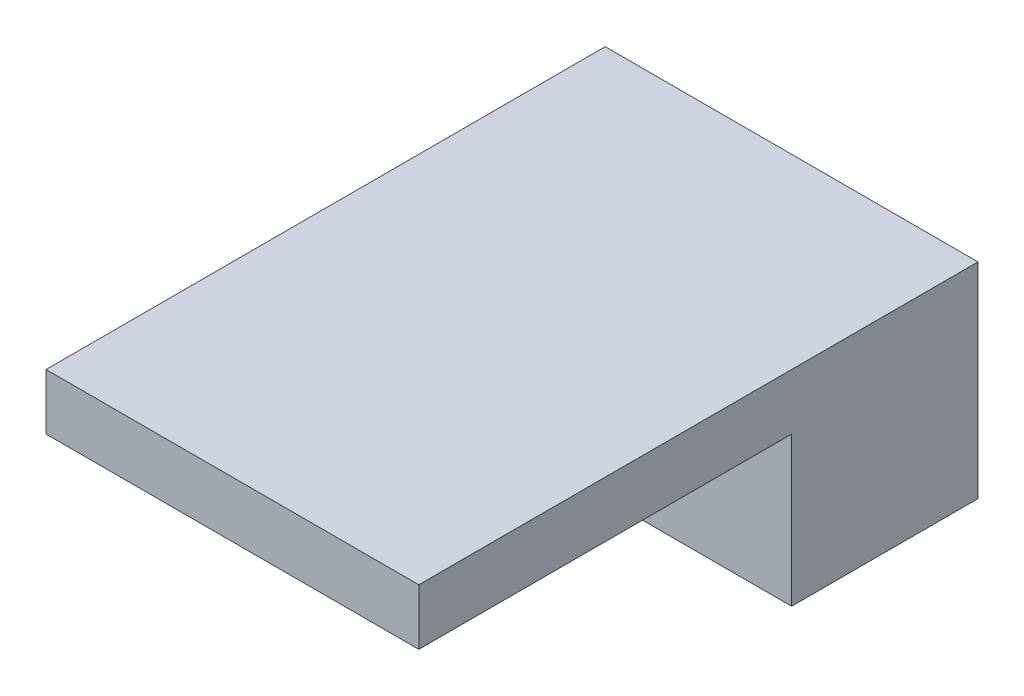
ISO-10303-21;
HEADER;
FILE_DESCRIPTION(('STEP AP214'),'2;1');
FILE_NAME('part.step','',(''),(''),'','','');
FILE_SCHEMA(('AUTOMOTIVE_DESIGN { 1 0 10303 214 1 1 1 1 }'));
ENDSEC;
DATA;
#1=APPLICATION_CONTEXT('core data for automotive mechanical design processes');
#2=APPLICATION_PROTOCOL_DEFINITION('international standard','automotive_design',2000,#1);
#3=PRODUCT_CONTEXT('',#1,'mechanical');
#4=PRODUCT('Part','Part','',(#3));
#5=PRODUCT_RELATED_PRODUCT_CATEGORY('part','',(#4));
#6=PRODUCT_DEFINITION_FORMATION('','',#4);
#7=PRODUCT_DEFINITION_CONTEXT('part definition',#1,'design');
#8=PRODUCT_DEFINITION('design','',#6,#7);
#9=PRODUCT_DEFINITION_SHAPE('','',#8);
#10=(LENGTH_UNIT() NAMED_UNIT(*) SI_UNIT(.MILLI.,.METRE.));
#11=(NAMED_UNIT(*) PLANE_ANGLE_UNIT() SI_UNIT($,.RADIAN.));
#12=(NAMED_UNIT(*) SI_UNIT($,.STERADIAN.) SOLID_ANGLE_UNIT());
#13=UNCERTAINTY_MEASURE_WITH_UNIT(LENGTH_MEASURE(1.E-05),#10,'distance_accuracy_value','');
#14=(GEOMETRIC_REPRESENTATION_CONTEXT(3) GLOBAL_UNCERTAINTY_ASSIGNED_CONTEXT((#13)) GLOBAL_UNIT_ASSIGNED_CONTEXT((#10,
#11,#12)) REPRESENTATION_CONTEXT('',''));
#15=CARTESIAN_POINT('',(0.,0.,0.));
#16=DIRECTION('',(0.,0.,1.));
#17=DIRECTION('',(1.,0.,0.));
#18=AXIS2_PLACEMENT_3D('',#15,#16,#17);
#19=CARTESIAN_POINT('',(0.,3.,0.));
#20=DIRECTION('',(0.,0.,-1.));
#21=DIRECTION('',(-1.,0.,0.));
#22=AXIS2_PLACEMENT_3D('',#19,#20,#21);
#23=PLANE('',#22);
#24=DIRECTION('',(0.,-1.,0.));
#25=VECTOR('',#24,1.);
#26=CARTESIAN_POINT('',(20.,3.,0.));
#27=LINE('',#26,#25);
#28=CARTESIAN_POINT('',(20.,3.,0.));
#29=VERTEX_POINT('',#28);
#30=CARTESIAN_POINT('',(20.,-8.,0.));
#31=VERTEX_POINT('',#30);
#32=EDGE_CURVE('E49',#29,#31,#27,.T.);
#33=ORIENTED_EDGE('',*,*,#32,.T.);
#34=DIRECTION('',(1.,0.,0.));
#35=VECTOR('',#34,1.);
#36=CARTESIAN_POINT('',(0.,-8.,0.));
#37=LINE('',#36,#35);
#38=CARTESIAN_POINT('',(0.,-8.,0.));
#39=VERTEX_POINT('',#38);
#40=EDGE_CURVE('E113',#39,#31,#37,.T.);
#41=ORIENTED_EDGE('',*,*,#40,.F.);
#42=DIRECTION('',(0.,-1.,0.));
#43=VECTOR('',#42,1.);
#44=CARTESIAN_POINT('',(0.,3.,0.));
#45=LINE('',#44,#43);
#46=CARTESIAN_POINT('',(0.,3.,0.));
#47=VERTEX_POINT('',#46);
#48=EDGE_CURVE('E11',#47,#39,#45,.T.);
#49=ORIENTED_EDGE('',*,*,#48,.F.);
#50=DIRECTION('',(1.,0.,0.));
#51=VECTOR('',#50,1.);
#52=CARTESIAN_POINT('',(0.,3.,0.));
#53=LINE('',#52,#51);
#54=EDGE_CURVE('E141',#47,#29,#53,.T.);
#55=ORIENTED_EDGE('',*,*,#54,.T.);
#56=EDGE_LOOP('',(#33,#41,#49,#55));
#57=FACE_BOUND('',#56,.T.);
#58=ADVANCED_FACE('F46',(#57),#23,.T.);
#59=CARTESIAN_POINT('',(0.,3.,0.));
#60=DIRECTION('',(1.,0.,0.));
#61=DIRECTION('',(0.,0.,-1.));
#62=AXIS2_PLACEMENT_3D('',#59,#60,#61);
#63=PLANE('',#62);
#64=ORIENTED_EDGE('',*,*,#48,.T.);
#65=DIRECTION('',(0.,0.,-1.));
#66=VECTOR('',#65,1.);
#67=CARTESIAN_POINT('',(0.,-8.,10.));
#68=LINE('',#67,#66);
#69=CARTESIAN_POINT('',(0.,-8.,10.));
#70=VERTEX_POINT('',#69);
#71=EDGE_CURVE('E109',#70,#39,#68,.T.);
#72=ORIENTED_EDGE('',*,*,#71,.F.);
#73=DIRECTION('',(0.,1.,0.));
#74=VECTOR('',#73,1.);
#75=CARTESIAN_POINT('',(0.,-8.,10.));
#76=LINE('',#75,#74);
#77=CARTESIAN_POINT('',(0.,0.,10.));
#78=VERTEX_POINT('',#77);
#79=EDGE_CURVE('E132',#70,#78,#76,.T.);
#80=ORIENTED_EDGE('',*,*,#79,.T.);
#81=DIRECTION('',(0.,0.,1.));
#82=VECTOR('',#81,1.);
#83=CARTESIAN_POINT('',(0.,0.,0.));
#84=LINE('',#83,#82);
#85=CARTESIAN_POINT('',(0.,0.,30.));
#86=VERTEX_POINT('',#85);
#87=EDGE_CURVE('E85',#78,#86,#84,.T.);
#88=ORIENTED_EDGE('',*,*,#87,.T.);
#89=DIRECTION('',(0.,-1.,0.));
#90=VECTOR('',#89,1.);
#91=CARTESIAN_POINT('',(0.,3.,30.));
#92=LINE('',#91,#90);
#93=CARTESIAN_POINT('',(0.,3.,30.));
#94=VERTEX_POINT('',#93);
#95=EDGE_CURVE('E55',#94,#86,#92,.T.);
#96=ORIENTED_EDGE('',*,*,#95,.F.);
#97=DIRECTION('',(0.,0.,1.));
#98=VECTOR('',#97,1.);
#99=CARTESIAN_POINT('',(0.,3.,0.));
#100=LINE('',#99,#98);
#101=EDGE_CURVE('E110',#47,#94,#100,.T.);
#102=ORIENTED_EDGE('',*,*,#101,.F.);
#103=EDGE_LOOP('',(#64,#72,#80,#88,#96,#102));
#104=FACE_BOUND('',#103,.T.);
#105=ADVANCED_FACE('F107',(#104),#63,.F.);
#106=CARTESIAN_POINT('',(0.,3.,30.));
#107=DIRECTION('',(0.,0.,-1.));
#108=DIRECTION('',(-1.,0.,0.));
#109=AXIS2_PLACEMENT_3D('',#106,#107,#108);
#110=PLANE('',#109);
#111=DIRECTION('',(1.,0.,0.));
#112=VECTOR('',#111,1.);
#113=CARTESIAN_POINT('',(0.,0.,30.));
#114=LINE('',#113,#112);
#115=CARTESIAN_POINT('',(20.,0.,30.));
#116=VERTEX_POINT('',#115);
#117=EDGE_CURVE('E154',#86,#116,#114,.T.);
#118=ORIENTED_EDGE('',*,*,#117,.T.);
#119=DIRECTION('',(0.,-1.,0.));
#120=VECTOR('',#119,1.);
#121=CARTESIAN_POINT('',(20.,3.,30.));
#122=LINE('',#121,#120);
#123=CARTESIAN_POINT('',(20.,3.,30.));
#124=VERTEX_POINT('',#123);
#125=EDGE_CURVE('E161',#124,#116,#122,.T.);
#126=ORIENTED_EDGE('',*,*,#125,.F.);
#127=DIRECTION('',(1.,0.,0.));
#128=VECTOR('',#127,1.);
#129=CARTESIAN_POINT('',(0.,3.,30.));
#130=LINE('',#129,#128);
#131=EDGE_CURVE('E147',#94,#124,#130,.T.);
#132=ORIENTED_EDGE('',*,*,#131,.F.);
#133=ORIENTED_EDGE('',*,*,#95,.T.);
#134=EDGE_LOOP('',(#118,#126,#132,#133));
#135=FACE_BOUND('',#134,.T.);
#136=ADVANCED_FACE('F205',(#135),#110,.F.);
#137=CARTESIAN_POINT('',(20.,3.,0.));
#138=DIRECTION('',(1.,0.,0.));
#139=DIRECTION('',(0.,0.,-1.));
#140=AXIS2_PLACEMENT_3D('',#137,#138,#139);
#141=PLANE('',#140);
#142=DIRECTION('',(0.,0.,1.));
#143=VECTOR('',#142,1.);
#144=CARTESIAN_POINT('',(20.,0.,0.));
#145=LINE('',#144,#143);
#146=CARTESIAN_POINT('',(20.,0.,10.));
#147=VERTEX_POINT('',#146);
#148=EDGE_CURVE('E140',#147,#116,#145,.T.);
#149=ORIENTED_EDGE('',*,*,#148,.F.);
#150=DIRECTION('',(0.,1.,0.));
#151=VECTOR('',#150,1.);
#152=CARTESIAN_POINT('',(20.,-8.,10.));
#153=LINE('',#152,#151);
#154=CARTESIAN_POINT('',(20.,-8.,10.));
#155=VERTEX_POINT('',#154);
#156=EDGE_CURVE('E136',#155,#147,#153,.T.);
#157=ORIENTED_EDGE('',*,*,#156,.F.);
#158=DIRECTION('',(0.,0.,1.));
#159=VECTOR('',#158,1.);
#160=CARTESIAN_POINT('',(20.,-8.,0.));
#161=LINE('',#160,#159);
#162=EDGE_CURVE('E116',#31,#155,#161,.T.);
#163=ORIENTED_EDGE('',*,*,#162,.F.);
#164=ORIENTED_EDGE('',*,*,#32,.F.);
#165=DIRECTION('',(0.,0.,1.));
#166=VECTOR('',#165,1.);
#167=CARTESIAN_POINT('',(20.,3.,0.));
#168=LINE('',#167,#166);
#169=EDGE_CURVE('E144',#29,#124,#168,.T.);
#170=ORIENTED_EDGE('',*,*,#169,.T.);
#171=ORIENTED_EDGE('',*,*,#125,.T.);
#172=EDGE_LOOP('',(#149,#157,#163,#164,#170,#171));
#173=FACE_BOUND('',#172,.T.);
#174=ADVANCED_FACE('F200',(#173),#141,.T.);
#175=CARTESIAN_POINT('',(0.,3.,0.));
#176=DIRECTION('',(0.,-1.,0.));
#177=DIRECTION('',(0.,0.,-1.));
#178=AXIS2_PLACEMENT_3D('',#175,#176,#177);
#179=PLANE('',#178);
#180=ORIENTED_EDGE('',*,*,#54,.F.);
#181=ORIENTED_EDGE('',*,*,#101,.T.);
#182=ORIENTED_EDGE('',*,*,#131,.T.);
#183=ORIENTED_EDGE('',*,*,#169,.F.);
#184=EDGE_LOOP('',(#180,#181,#182,#183));
#185=FACE_BOUND('',#184,.T.);
#186=ADVANCED_FACE('F216',(#185),#179,.F.);
#187=CARTESIAN_POINT('',(0.,0.,0.));
#188=DIRECTION('',(0.,-1.,0.));
#189=DIRECTION('',(0.,0.,-1.));
#190=AXIS2_PLACEMENT_3D('',#187,#188,#189);
#191=PLANE('',#190);
#192=DIRECTION('',(-1.,0.,0.));
#193=VECTOR('',#192,1.);
#194=CARTESIAN_POINT('',(0.,0.,10.));
#195=LINE('',#194,#193);
#196=EDGE_CURVE('E63',#147,#78,#195,.T.);
#197=ORIENTED_EDGE('',*,*,#196,.F.);
#198=ORIENTED_EDGE('',*,*,#148,.T.);
#199=ORIENTED_EDGE('',*,*,#117,.F.);
#200=ORIENTED_EDGE('',*,*,#87,.F.);
#201=EDGE_LOOP('',(#197,#198,#199,#200));
#202=FACE_BOUND('',#201,.T.);
#203=ADVANCED_FACE('F206',(#202),#191,.T.);
#204=CARTESIAN_POINT('',(0.,-8.,10.));
#205=DIRECTION('',(0.,0.,-1.));
#206=DIRECTION('',(-1.,0.,0.));
#207=AXIS2_PLACEMENT_3D('',#204,#205,#206);
#208=PLANE('',#207);
#209=ORIENTED_EDGE('',*,*,#196,.T.);
#210=ORIENTED_EDGE('',*,*,#79,.F.);
#211=DIRECTION('',(-1.,0.,0.));
#212=VECTOR('',#211,1.);
#213=CARTESIAN_POINT('',(0.,-8.,10.));
#214=LINE('',#213,#212);
#215=EDGE_CURVE('E120',#155,#70,#214,.T.);
#216=ORIENTED_EDGE('',*,*,#215,.F.);
#217=ORIENTED_EDGE('',*,*,#156,.T.);
#218=EDGE_LOOP('',(#209,#210,#216,#217));
#219=FACE_BOUND('',#218,.T.);
#220=ADVANCED_FACE('F208',(#219),#208,.F.);
#221=CARTESIAN_POINT('',(0.,-8.,0.));
#222=DIRECTION('',(0.,-1.,0.));
#223=DIRECTION('',(0.,0.,-1.));
#224=AXIS2_PLACEMENT_3D('',#221,#222,#223);
#225=PLANE('',#224);
#226=ORIENTED_EDGE('',*,*,#71,.T.);
#227=ORIENTED_EDGE('',*,*,#40,.T.);
#228=ORIENTED_EDGE('',*,*,#162,.T.);
#229=ORIENTED_EDGE('',*,*,#215,.T.);
#230=EDGE_LOOP('',(#226,#227,#228,#229));
#231=FACE_BOUND('',#230,.T.);
#232=ADVANCED_FACE('F118',(#231),#225,.T.);
#233=CLOSED_SHELL('',(#58,#105,#136,#174,#186,#203,#220,#232));
#234=MANIFOLD_SOLID_BREP('B2',#233);
#235=ADVANCED_BREP_SHAPE_REPRESENTATION('',(#18,#234),#14);
#236=SHAPE_DEFINITION_REPRESENTATION(#9,#235);
ENDSEC;
END-ISO-10303-21;
